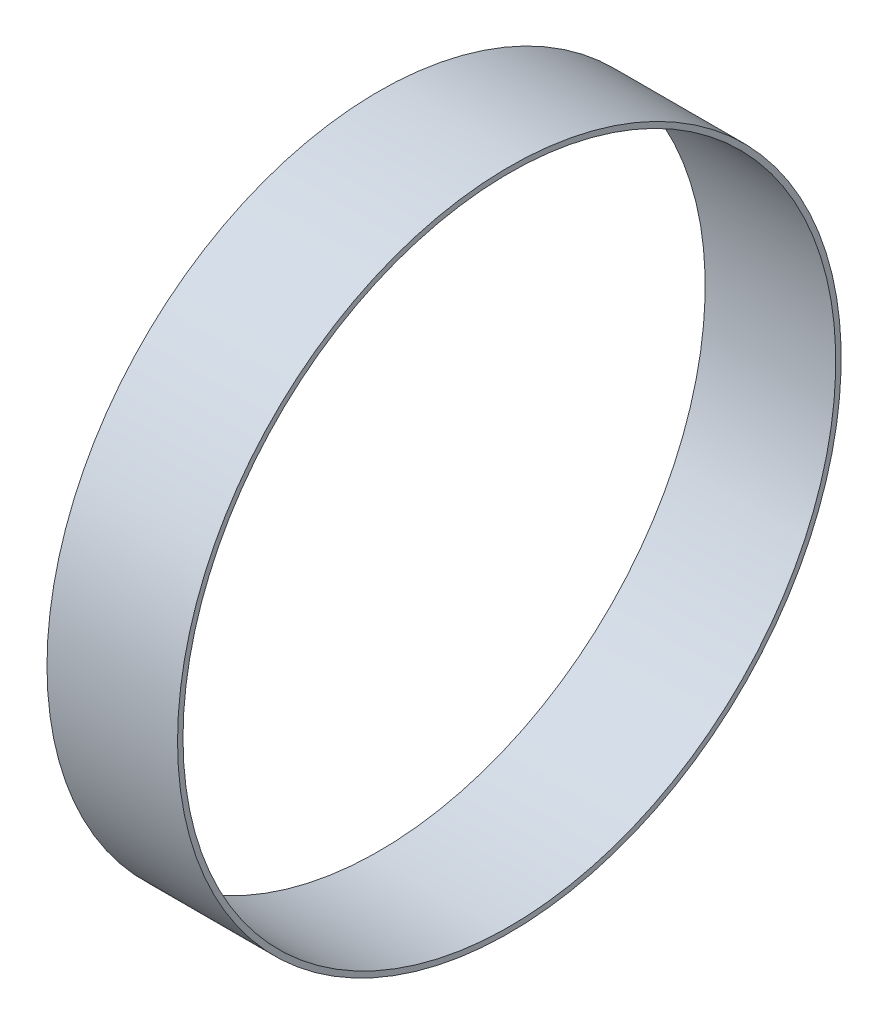
ISO-10303-21;
HEADER;
FILE_DESCRIPTION(('STEP AP214'),'2;1');
FILE_NAME('part.step','',(''),(''),'','','');
FILE_SCHEMA(('AUTOMOTIVE_DESIGN { 1 0 10303 214 1 1 1 1 }'));
ENDSEC;
DATA;
#1=APPLICATION_CONTEXT('core data for automotive mechanical design processes');
#2=APPLICATION_PROTOCOL_DEFINITION('international standard','automotive_design',2000,#1);
#3=PRODUCT_CONTEXT('',#1,'mechanical');
#4=PRODUCT('Part','Part','',(#3));
#5=PRODUCT_RELATED_PRODUCT_CATEGORY('part','',(#4));
#6=PRODUCT_DEFINITION_FORMATION('','',#4);
#7=PRODUCT_DEFINITION_CONTEXT('part definition',#1,'design');
#8=PRODUCT_DEFINITION('design','',#6,#7);
#9=PRODUCT_DEFINITION_SHAPE('','',#8);
#10=(LENGTH_UNIT() NAMED_UNIT(*) SI_UNIT(.MILLI.,.METRE.));
#11=(NAMED_UNIT(*) PLANE_ANGLE_UNIT() SI_UNIT($,.RADIAN.));
#12=(NAMED_UNIT(*) SI_UNIT($,.STERADIAN.) SOLID_ANGLE_UNIT());
#13=UNCERTAINTY_MEASURE_WITH_UNIT(LENGTH_MEASURE(1.E-05),#10,'distance_accuracy_value','');
#14=(GEOMETRIC_REPRESENTATION_CONTEXT(3) GLOBAL_UNCERTAINTY_ASSIGNED_CONTEXT((#13)) GLOBAL_UNIT_ASSIGNED_CONTEXT((#10,
#11,#12)) REPRESENTATION_CONTEXT('',''));
#15=CARTESIAN_POINT('',(0.,0.,0.));
#16=DIRECTION('',(0.,0.,1.));
#17=DIRECTION('',(1.,0.,0.));
#18=AXIS2_PLACEMENT_3D('',#15,#16,#17);
#19=CARTESIAN_POINT('',(76.2,0.,0.));
#20=DIRECTION('',(1.,0.,0.));
#21=DIRECTION('',(0.,0.,-1.));
#22=AXIS2_PLACEMENT_3D('',#19,#20,#21);
#23=PLANE('',#22);
#24=CARTESIAN_POINT('',(76.2,0.,0.));
#25=DIRECTION('',(1.,0.,0.));
#26=DIRECTION('',(0.,0.,-1.));
#27=AXIS2_PLACEMENT_3D('',#24,#25,#26);
#28=CIRCLE('',#27,193.675);
#29=CARTESIAN_POINT('',(76.2,0.,193.675));
#30=VERTEX_POINT('',#29);
#31=EDGE_CURVE('E10',#30,#30,#28,.T.);
#32=ORIENTED_EDGE('',*,*,#31,.T.);
#33=EDGE_LOOP('',(#32));
#34=FACE_BOUND('',#33,.T.);
#35=CARTESIAN_POINT('',(76.2,0.,0.));
#36=DIRECTION('',(1.,0.,0.));
#37=DIRECTION('',(0.,0.,-1.));
#38=AXIS2_PLACEMENT_3D('',#35,#36,#37);
#39=CIRCLE('',#38,190.5);
#40=CARTESIAN_POINT('',(76.2,0.,190.5));
#41=VERTEX_POINT('',#40);
#42=EDGE_CURVE('E50',#41,#41,#39,.T.);
#43=ORIENTED_EDGE('',*,*,#42,.F.);
#44=EDGE_LOOP('',(#43));
#45=FACE_BOUND('',#44,.T.);
#46=ADVANCED_FACE('F37',(#34,#45),#23,.T.);
#47=CARTESIAN_POINT('',(0.,0.,0.));
#48=DIRECTION('',(1.,0.,0.));
#49=DIRECTION('',(0.,0.,-1.));
#50=AXIS2_PLACEMENT_3D('',#47,#48,#49);
#51=PLANE('',#50);
#52=CARTESIAN_POINT('',(0.,0.,0.));
#53=DIRECTION('',(1.,0.,0.));
#54=DIRECTION('',(0.,0.,-1.));
#55=AXIS2_PLACEMENT_3D('',#52,#53,#54);
#56=CIRCLE('',#55,193.675);
#57=CARTESIAN_POINT('',(0.,0.,193.675));
#58=VERTEX_POINT('',#57);
#59=EDGE_CURVE('E41',#58,#58,#56,.T.);
#60=ORIENTED_EDGE('',*,*,#59,.F.);
#61=EDGE_LOOP('',(#60));
#62=FACE_BOUND('',#61,.T.);
#63=CARTESIAN_POINT('',(0.,0.,0.));
#64=DIRECTION('',(1.,0.,0.));
#65=DIRECTION('',(0.,0.,-1.));
#66=AXIS2_PLACEMENT_3D('',#63,#64,#65);
#67=CIRCLE('',#66,190.5);
#68=CARTESIAN_POINT('',(0.,0.,190.5));
#69=VERTEX_POINT('',#68);
#70=EDGE_CURVE('E52',#69,#69,#67,.T.);
#71=ORIENTED_EDGE('',*,*,#70,.T.);
#72=EDGE_LOOP('',(#71));
#73=FACE_BOUND('',#72,.T.);
#74=ADVANCED_FACE('F64',(#62,#73),#51,.F.);
#75=CARTESIAN_POINT('',(76.2,0.,0.));
#76=DIRECTION('',(-1.,0.,0.));
#77=DIRECTION('',(0.,0.,1.));
#78=AXIS2_PLACEMENT_3D('',#75,#76,#77);
#79=CYLINDRICAL_SURFACE('',#78,193.675);
#80=CARTESIAN_POINT('',(76.2,0.,193.675));
#81=CARTESIAN_POINT('',(75.40625,0.,193.675));
#82=CARTESIAN_POINT('',(74.6125,0.,193.675));
#83=CARTESIAN_POINT('',(73.025,0.,193.675));
#84=CARTESIAN_POINT('',(72.23125,0.,193.675));
#85=CARTESIAN_POINT('',(70.64375,0.,193.675));
#86=CARTESIAN_POINT('',(69.85,0.,193.675));
#87=CARTESIAN_POINT('',(68.2625,0.,193.675));
#88=CARTESIAN_POINT('',(67.46875,0.,193.675));
#89=CARTESIAN_POINT('',(65.88125,0.,193.675));
#90=CARTESIAN_POINT('',(65.0875,0.,193.675));
#91=CARTESIAN_POINT('',(63.5,0.,193.675));
#92=CARTESIAN_POINT('',(62.70625,0.,193.675));
#93=CARTESIAN_POINT('',(61.11875,0.,193.675));
#94=CARTESIAN_POINT('',(60.325,0.,193.675));
#95=CARTESIAN_POINT('',(58.7375,0.,193.675));
#96=CARTESIAN_POINT('',(57.94375,0.,193.675));
#97=CARTESIAN_POINT('',(56.35625,0.,193.675));
#98=CARTESIAN_POINT('',(55.5625,0.,193.675));
#99=CARTESIAN_POINT('',(53.975,0.,193.675));
#100=CARTESIAN_POINT('',(53.18125,0.,193.675));
#101=CARTESIAN_POINT('',(51.59375,0.,193.675));
#102=CARTESIAN_POINT('',(50.8,0.,193.675));
#103=CARTESIAN_POINT('',(49.2125,0.,193.675));
#104=CARTESIAN_POINT('',(48.41875,0.,193.675));
#105=CARTESIAN_POINT('',(46.83125,0.,193.675));
#106=CARTESIAN_POINT('',(46.0375,0.,193.675));
#107=CARTESIAN_POINT('',(44.45,0.,193.675));
#108=CARTESIAN_POINT('',(43.65625,0.,193.675));
#109=CARTESIAN_POINT('',(42.06875,0.,193.675));
#110=CARTESIAN_POINT('',(41.275,0.,193.675));
#111=CARTESIAN_POINT('',(39.6875,0.,193.675));
#112=CARTESIAN_POINT('',(38.89375,0.,193.675));
#113=CARTESIAN_POINT('',(37.30625,0.,193.675));
#114=CARTESIAN_POINT('',(36.5125,0.,193.675));
#115=CARTESIAN_POINT('',(34.925,0.,193.675));
#116=CARTESIAN_POINT('',(34.13125,0.,193.675));
#117=CARTESIAN_POINT('',(32.54375,0.,193.675));
#118=CARTESIAN_POINT('',(31.75,0.,193.675));
#119=CARTESIAN_POINT('',(30.1625,0.,193.675));
#120=CARTESIAN_POINT('',(29.36875,0.,193.675));
#121=CARTESIAN_POINT('',(27.78125,0.,193.675));
#122=CARTESIAN_POINT('',(26.9875,0.,193.675));
#123=CARTESIAN_POINT('',(25.4,0.,193.675));
#124=CARTESIAN_POINT('',(24.60625,0.,193.675));
#125=CARTESIAN_POINT('',(23.01875,0.,193.675));
#126=CARTESIAN_POINT('',(22.225,0.,193.675));
#127=CARTESIAN_POINT('',(20.6375,0.,193.675));
#128=CARTESIAN_POINT('',(19.84375,0.,193.675));
#129=CARTESIAN_POINT('',(18.25625,0.,193.675));
#130=CARTESIAN_POINT('',(17.4625,0.,193.675));
#131=CARTESIAN_POINT('',(15.875,0.,193.675));
#132=CARTESIAN_POINT('',(15.08125,0.,193.675));
#133=CARTESIAN_POINT('',(13.49375,0.,193.675));
#134=CARTESIAN_POINT('',(12.7,0.,193.675));
#135=CARTESIAN_POINT('',(11.1125,0.,193.675));
#136=CARTESIAN_POINT('',(10.31875,0.,193.675));
#137=CARTESIAN_POINT('',(8.73125,0.,193.675));
#138=CARTESIAN_POINT('',(7.93750000000001,0.,193.675));
#139=CARTESIAN_POINT('',(6.35,0.,193.675));
#140=CARTESIAN_POINT('',(5.55625,0.,193.675));
#141=CARTESIAN_POINT('',(3.96875,0.,193.675));
#142=CARTESIAN_POINT('',(3.175,0.,193.675));
#143=CARTESIAN_POINT('',(1.5875,0.,193.675));
#144=CARTESIAN_POINT('',(0.793750000000001,0.,193.675));
#145=CARTESIAN_POINT('',(0.,0.,193.675));
#146=B_SPLINE_CURVE_WITH_KNOTS('',3,(#80,#81,#82,#83,#84,#85,#86,#87,#88,#89,#90,#91,#92,#93,
#94,#95,#96,#97,#98,#99,#100,#101,#102,#103,#104,#105,#106,#107,#108,#109,#110,#111,#112,#113,
#114,#115,#116,#117,#118,#119,#120,#121,#122,#123,#124,#125,#126,#127,#128,#129,#130,#131,#132,
#133,#134,#135,#136,#137,#138,#139,#140,#141,#142,#143,#144,#145),.UNSPECIFIED.,.F.,.F.,(4,2,2,
2,2,2,2,2,2,2,2,2,2,2,2,2,2,2,2,2,2,2,2,2,2,2,2,2,2,2,2,2,4),(0.,2.38125,4.7625,7.14375,
9.52500000000001,11.90625,14.2875,16.66875,19.05,21.43125,23.8125,26.19375,28.575,30.95625,
33.3375,35.71875,38.1,40.48125,42.8625,45.24375,47.625,50.00625,52.3875,54.76875,57.15,59.53125,
61.9125,64.29375,66.675,69.05625,71.4375,73.81875,76.2),.UNSPECIFIED.);
#147=EDGE_CURVE('BSEAM39',#30,#58,#146,.T.);
#148=ORIENTED_EDGE('',*,*,#31,.F.);
#149=ORIENTED_EDGE('',*,*,#59,.T.);
#150=ORIENTED_EDGE('',*,*,#147,.T.);
#151=ORIENTED_EDGE('',*,*,#147,.F.);
#152=EDGE_LOOP('',(#148,#150,#149,#151));
#153=FACE_BOUND('',#152,.T.);
#154=ADVANCED_FACE('F39',(#153),#79,.T.);
#155=CARTESIAN_POINT('',(76.2,0.,0.));
#156=DIRECTION('',(-1.,0.,0.));
#157=DIRECTION('',(0.,0.,1.));
#158=AXIS2_PLACEMENT_3D('',#155,#156,#157);
#159=CYLINDRICAL_SURFACE('',#158,190.5);
#160=CARTESIAN_POINT('',(76.2,0.,190.5));
#161=CARTESIAN_POINT('',(75.40625,0.,190.5));
#162=CARTESIAN_POINT('',(74.6125,0.,190.5));
#163=CARTESIAN_POINT('',(73.025,0.,190.5));
#164=CARTESIAN_POINT('',(72.23125,0.,190.5));
#165=CARTESIAN_POINT('',(70.64375,0.,190.5));
#166=CARTESIAN_POINT('',(69.85,0.,190.5));
#167=CARTESIAN_POINT('',(68.2625,0.,190.5));
#168=CARTESIAN_POINT('',(67.46875,0.,190.5));
#169=CARTESIAN_POINT('',(65.88125,0.,190.5));
#170=CARTESIAN_POINT('',(65.0875,0.,190.5));
#171=CARTESIAN_POINT('',(63.5,0.,190.5));
#172=CARTESIAN_POINT('',(62.70625,0.,190.5));
#173=CARTESIAN_POINT('',(61.11875,0.,190.5));
#174=CARTESIAN_POINT('',(60.325,0.,190.5));
#175=CARTESIAN_POINT('',(58.7375,0.,190.5));
#176=CARTESIAN_POINT('',(57.94375,0.,190.5));
#177=CARTESIAN_POINT('',(56.35625,0.,190.5));
#178=CARTESIAN_POINT('',(55.5625,0.,190.5));
#179=CARTESIAN_POINT('',(53.975,0.,190.5));
#180=CARTESIAN_POINT('',(53.18125,0.,190.5));
#181=CARTESIAN_POINT('',(51.59375,0.,190.5));
#182=CARTESIAN_POINT('',(50.8,0.,190.5));
#183=CARTESIAN_POINT('',(49.2125,0.,190.5));
#184=CARTESIAN_POINT('',(48.41875,0.,190.5));
#185=CARTESIAN_POINT('',(46.83125,0.,190.5));
#186=CARTESIAN_POINT('',(46.0375,0.,190.5));
#187=CARTESIAN_POINT('',(44.45,0.,190.5));
#188=CARTESIAN_POINT('',(43.65625,0.,190.5));
#189=CARTESIAN_POINT('',(42.06875,0.,190.5));
#190=CARTESIAN_POINT('',(41.275,0.,190.5));
#191=CARTESIAN_POINT('',(39.6875,0.,190.5));
#192=CARTESIAN_POINT('',(38.89375,0.,190.5));
#193=CARTESIAN_POINT('',(37.30625,0.,190.5));
#194=CARTESIAN_POINT('',(36.5125,0.,190.5));
#195=CARTESIAN_POINT('',(34.925,0.,190.5));
#196=CARTESIAN_POINT('',(34.13125,0.,190.5));
#197=CARTESIAN_POINT('',(32.54375,0.,190.5));
#198=CARTESIAN_POINT('',(31.75,0.,190.5));
#199=CARTESIAN_POINT('',(30.1625,0.,190.5));
#200=CARTESIAN_POINT('',(29.36875,0.,190.5));
#201=CARTESIAN_POINT('',(27.78125,0.,190.5));
#202=CARTESIAN_POINT('',(26.9875,0.,190.5));
#203=CARTESIAN_POINT('',(25.4,0.,190.5));
#204=CARTESIAN_POINT('',(24.60625,0.,190.5));
#205=CARTESIAN_POINT('',(23.01875,0.,190.5));
#206=CARTESIAN_POINT('',(22.225,0.,190.5));
#207=CARTESIAN_POINT('',(20.6375,0.,190.5));
#208=CARTESIAN_POINT('',(19.84375,0.,190.5));
#209=CARTESIAN_POINT('',(18.25625,0.,190.5));
#210=CARTESIAN_POINT('',(17.4625,0.,190.5));
#211=CARTESIAN_POINT('',(15.875,0.,190.5));
#212=CARTESIAN_POINT('',(15.08125,0.,190.5));
#213=CARTESIAN_POINT('',(13.49375,0.,190.5));
#214=CARTESIAN_POINT('',(12.7,0.,190.5));
#215=CARTESIAN_POINT('',(11.1125,0.,190.5));
#216=CARTESIAN_POINT('',(10.31875,0.,190.5));
#217=CARTESIAN_POINT('',(8.73125,0.,190.5));
#218=CARTESIAN_POINT('',(7.93750000000001,0.,190.5));
#219=CARTESIAN_POINT('',(6.35,0.,190.5));
#220=CARTESIAN_POINT('',(5.55625,0.,190.5));
#221=CARTESIAN_POINT('',(3.96875,0.,190.5));
#222=CARTESIAN_POINT('',(3.175,0.,190.5));
#223=CARTESIAN_POINT('',(1.5875,0.,190.5));
#224=CARTESIAN_POINT('',(0.793750000000001,0.,190.5));
#225=CARTESIAN_POINT('',(0.,0.,190.5));
#226=B_SPLINE_CURVE_WITH_KNOTS('',3,(#160,#161,#162,#163,#164,#165,#166,#167,#168,#169,#170,
#171,#172,#173,#174,#175,#176,#177,#178,#179,#180,#181,#182,#183,#184,#185,#186,#187,#188,#189,
#190,#191,#192,#193,#194,#195,#196,#197,#198,#199,#200,#201,#202,#203,#204,#205,#206,#207,#208,
#209,#210,#211,#212,#213,#214,#215,#216,#217,#218,#219,#220,#221,#222,#223,#224,#225),
.UNSPECIFIED.,.F.,.F.,(4,2,2,2,2,2,2,2,2,2,2,2,2,2,2,2,2,2,2,2,2,2,2,2,2,2,2,2,2,2,2,2,4),(0.,
2.38124999999999,4.76249999999999,7.14374999999999,9.52499999999999,11.90625,14.2875,16.66875,
19.05,21.43125,23.8125,26.19375,28.575,30.95625,33.3375,35.71875,38.1,40.48125,42.8625,45.24375,
47.625,50.00625,52.3875,54.76875,57.15,59.53125,61.9125,64.29375,66.675,69.05625,71.4375,
73.81875,76.2),.UNSPECIFIED.);
#227=EDGE_CURVE('BSEAM60',#41,#69,#226,.T.);
#228=ORIENTED_EDGE('',*,*,#42,.T.);
#229=ORIENTED_EDGE('',*,*,#70,.F.);
#230=ORIENTED_EDGE('',*,*,#227,.T.);
#231=ORIENTED_EDGE('',*,*,#227,.F.);
#232=EDGE_LOOP('',(#228,#230,#229,#231));
#233=FACE_BOUND('',#232,.T.);
#234=ADVANCED_FACE('F60',(#233),#159,.F.);
#235=CLOSED_SHELL('',(#46,#74,#154,#234));
#236=MANIFOLD_SOLID_BREP('B2',#235);
#237=ADVANCED_BREP_SHAPE_REPRESENTATION('',(#18,#236),#14);
#238=SHAPE_DEFINITION_REPRESENTATION(#9,#237);
ENDSEC;
END-ISO-10303-21;
